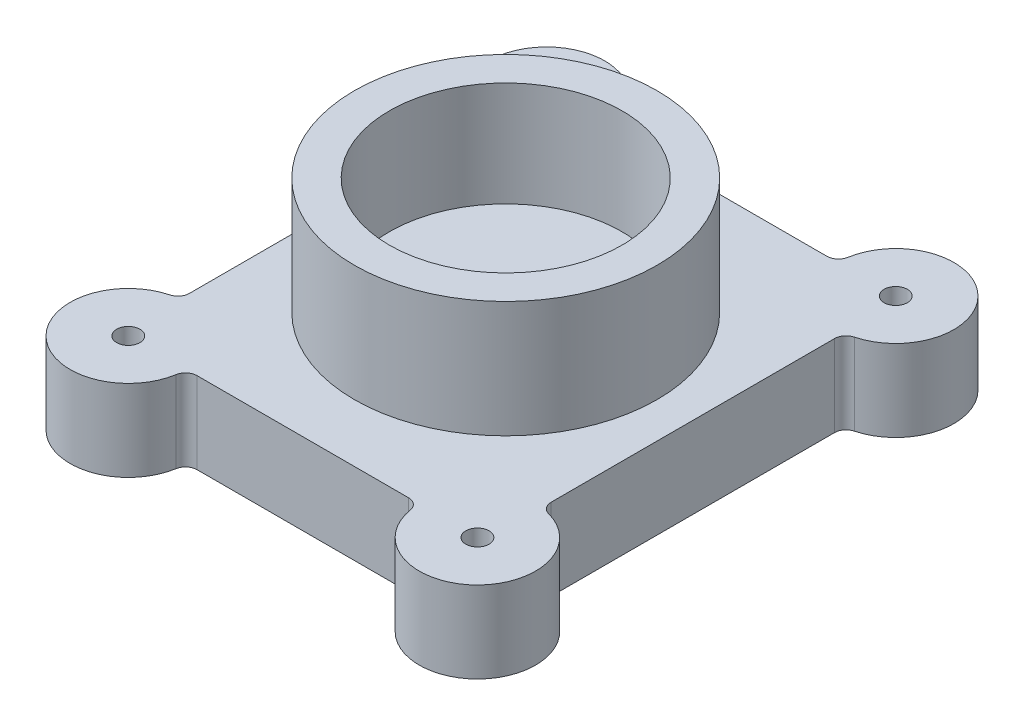
ISO-10303-21;
HEADER;
FILE_DESCRIPTION(('STEP AP214'),'2;1');
FILE_NAME('part.step','',(''),(''),'','','');
FILE_SCHEMA(('AUTOMOTIVE_DESIGN { 1 0 10303 214 1 1 1 1 }'));
ENDSEC;
DATA;
#1=APPLICATION_CONTEXT('core data for automotive mechanical design processes');
#2=APPLICATION_PROTOCOL_DEFINITION('international standard','automotive_design',2000,#1);
#3=PRODUCT_CONTEXT('',#1,'mechanical');
#4=PRODUCT('Part','Part','',(#3));
#5=PRODUCT_RELATED_PRODUCT_CATEGORY('part','',(#4));
#6=PRODUCT_DEFINITION_FORMATION('','',#4);
#7=PRODUCT_DEFINITION_CONTEXT('part definition',#1,'design');
#8=PRODUCT_DEFINITION('design','',#6,#7);
#9=PRODUCT_DEFINITION_SHAPE('','',#8);
#10=(LENGTH_UNIT() NAMED_UNIT(*) SI_UNIT(.MILLI.,.METRE.));
#11=(NAMED_UNIT(*) PLANE_ANGLE_UNIT() SI_UNIT($,.RADIAN.));
#12=(NAMED_UNIT(*) SI_UNIT($,.STERADIAN.) SOLID_ANGLE_UNIT());
#13=UNCERTAINTY_MEASURE_WITH_UNIT(LENGTH_MEASURE(1.E-05),#10,'distance_accuracy_value','');
#14=(GEOMETRIC_REPRESENTATION_CONTEXT(3) GLOBAL_UNCERTAINTY_ASSIGNED_CONTEXT((#13)) GLOBAL_UNIT_ASSIGNED_CONTEXT((#10,
#11,#12)) REPRESENTATION_CONTEXT('',''));
#15=CARTESIAN_POINT('',(0.,0.,0.));
#16=DIRECTION('',(0.,0.,1.));
#17=DIRECTION('',(1.,0.,0.));
#18=AXIS2_PLACEMENT_3D('',#15,#16,#17);
#19=CARTESIAN_POINT('',(-85.4507787273954,70.,189.708800959327));
#20=DIRECTION('',(0.,-1.,0.));
#21=DIRECTION('',(0.,0.,-1.));
#22=AXIS2_PLACEMENT_3D('',#19,#20,#21);
#23=CYLINDRICAL_SURFACE('',#22,10.);
#24=CARTESIAN_POINT('',(-85.4507787273954,0.,189.708800959327));
#25=DIRECTION('',(0.,-1.,0.));
#26=DIRECTION('',(0.,0.,-1.));
#27=AXIS2_PLACEMENT_3D('',#24,#25,#26);
#28=CIRCLE('',#27,10.);
#29=CARTESIAN_POINT('',(-95.310911699228,0.,188.04213429266));
#30=VERTEX_POINT('',#29);
#31=CARTESIAN_POINT('',(-85.4507787273954,0.,179.708800959327));
#32=VERTEX_POINT('',#31);
#33=EDGE_CURVE('E187',#30,#32,#28,.T.);
#34=ORIENTED_EDGE('',*,*,#33,.T.);
#35=DIRECTION('',(0.,-1.,0.));
#36=VECTOR('',#35,1.);
#37=CARTESIAN_POINT('',(-85.4507787273954,70.,179.708800959327));
#38=LINE('',#37,#36);
#39=CARTESIAN_POINT('',(-85.4507787273954,70.,179.708800959327));
#40=VERTEX_POINT('',#39);
#41=EDGE_CURVE('E48',#40,#32,#38,.T.);
#42=ORIENTED_EDGE('',*,*,#41,.F.);
#43=CARTESIAN_POINT('',(-85.4507787273954,70.,189.708800959327));
#44=DIRECTION('',(0.,-1.,0.));
#45=DIRECTION('',(0.,0.,-1.));
#46=AXIS2_PLACEMENT_3D('',#43,#44,#45);
#47=CIRCLE('',#46,10.);
#48=CARTESIAN_POINT('',(-95.310911699228,70.,188.04213429266));
#49=VERTEX_POINT('',#48);
#50=EDGE_CURVE('E231',#49,#40,#47,.T.);
#51=ORIENTED_EDGE('',*,*,#50,.F.);
#52=DIRECTION('',(0.,-1.,0.));
#53=VECTOR('',#52,1.);
#54=CARTESIAN_POINT('',(-95.310911699228,70.,188.04213429266));
#55=LINE('',#54,#53);
#56=EDGE_CURVE('E56',#49,#30,#55,.T.);
#57=ORIENTED_EDGE('',*,*,#56,.T.);
#58=EDGE_LOOP('',(#34,#42,#51,#57));
#59=FACE_BOUND('',#58,.T.);
#60=ADVANCED_FACE('F40',(#59),#23,.F.);
#61=CARTESIAN_POINT('',(-85.4507787273954,70.,179.708800959327));
#62=DIRECTION('',(0.,0.,-1.));
#63=DIRECTION('',(-1.,0.,0.));
#64=AXIS2_PLACEMENT_3D('',#61,#62,#63);
#65=PLANE('',#64);
#66=DIRECTION('',(1.,0.,0.));
#67=VECTOR('',#66,1.);
#68=CARTESIAN_POINT('',(-85.4507787273954,0.,179.708800959327));
#69=LINE('',#68,#67);
#70=CARTESIAN_POINT('',(96.2276256106123,0.,179.708800959327));
#71=VERTEX_POINT('',#70);
#72=EDGE_CURVE('E189',#32,#71,#69,.T.);
#73=ORIENTED_EDGE('',*,*,#72,.T.);
#74=DIRECTION('',(0.,-1.,0.));
#75=VECTOR('',#74,1.);
#76=CARTESIAN_POINT('',(96.2276256106123,70.,179.708800959327));
#77=LINE('',#76,#75);
#78=CARTESIAN_POINT('',(96.2276256106123,70.,179.708800959327));
#79=VERTEX_POINT('',#78);
#80=EDGE_CURVE('E256',#79,#71,#77,.T.);
#81=ORIENTED_EDGE('',*,*,#80,.F.);
#82=DIRECTION('',(1.,0.,0.));
#83=VECTOR('',#82,1.);
#84=CARTESIAN_POINT('',(-85.4507787273954,70.,179.708800959327));
#85=LINE('',#84,#83);
#86=EDGE_CURVE('E120',#40,#79,#85,.T.);
#87=ORIENTED_EDGE('',*,*,#86,.F.);
#88=ORIENTED_EDGE('',*,*,#41,.T.);
#89=EDGE_LOOP('',(#73,#81,#87,#88));
#90=FACE_BOUND('',#89,.T.);
#91=ADVANCED_FACE('F258',(#90),#65,.F.);
#92=CARTESIAN_POINT('',(96.2276256106124,70.,189.708800959327));
#93=DIRECTION('',(0.,-1.,0.));
#94=DIRECTION('',(0.,0.,-1.));
#95=AXIS2_PLACEMENT_3D('',#92,#93,#94);
#96=CYLINDRICAL_SURFACE('',#95,10.);
#97=CARTESIAN_POINT('',(96.2276256106124,0.,189.708800959327));
#98=DIRECTION('',(0.,1.,0.));
#99=DIRECTION('',(0.,0.,1.));
#100=AXIS2_PLACEMENT_3D('',#97,#98,#99);
#101=CIRCLE('',#100,10.);
#102=CARTESIAN_POINT('',(106.087758582445,0.,188.04213429266));
#103=VERTEX_POINT('',#102);
#104=EDGE_CURVE('E193',#103,#71,#101,.T.);
#105=ORIENTED_EDGE('',*,*,#104,.F.);
#106=DIRECTION('',(0.,-1.,0.));
#107=VECTOR('',#106,1.);
#108=CARTESIAN_POINT('',(106.087758582445,70.,188.04213429266));
#109=LINE('',#108,#107);
#110=CARTESIAN_POINT('',(106.087758582445,70.,188.04213429266));
#111=VERTEX_POINT('',#110);
#112=EDGE_CURVE('E254',#111,#103,#109,.T.);
#113=ORIENTED_EDGE('',*,*,#112,.F.);
#114=CARTESIAN_POINT('',(96.2276256106124,70.,189.708800959327));
#115=DIRECTION('',(0.,1.,0.));
#116=DIRECTION('',(0.,0.,1.));
#117=AXIS2_PLACEMENT_3D('',#114,#115,#116);
#118=CIRCLE('',#117,10.);
#119=EDGE_CURVE('E596',#111,#79,#118,.T.);
#120=ORIENTED_EDGE('',*,*,#119,.T.);
#121=ORIENTED_EDGE('',*,*,#80,.T.);
#122=EDGE_LOOP('',(#105,#113,#120,#121));
#123=FACE_BOUND('',#122,.T.);
#124=ADVANCED_FACE('F276',(#123),#96,.F.);
#125=CARTESIAN_POINT('',(155.388423441608,70.,179.708800959327));
#126=DIRECTION('',(0.,-1.,0.));
#127=DIRECTION('',(0.,0.,-1.));
#128=AXIS2_PLACEMENT_3D('',#125,#126,#127);
#129=CYLINDRICAL_SURFACE('',#128,50.);
#130=CARTESIAN_POINT('',(155.388423441608,0.,179.708800959327));
#131=DIRECTION('',(0.,1.,0.));
#132=DIRECTION('',(0.,0.,1.));
#133=AXIS2_PLACEMENT_3D('',#130,#131,#132);
#134=CIRCLE('',#133,50.);
#135=CARTESIAN_POINT('',(168.212109642949,0.,131.381240787003));
#136=VERTEX_POINT('',#135);
#137=EDGE_CURVE('E196',#103,#136,#134,.T.);
#138=ORIENTED_EDGE('',*,*,#137,.T.);
#139=DIRECTION('',(0.,-1.,0.));
#140=VECTOR('',#139,1.);
#141=CARTESIAN_POINT('',(168.212109642949,70.,131.381240787003));
#142=LINE('',#141,#140);
#143=CARTESIAN_POINT('',(168.212109642949,70.,131.381240787003));
#144=VERTEX_POINT('',#143);
#145=EDGE_CURVE('E252',#144,#136,#142,.T.);
#146=ORIENTED_EDGE('',*,*,#145,.F.);
#147=CARTESIAN_POINT('',(155.388423441608,70.,179.708800959327));
#148=DIRECTION('',(0.,1.,0.));
#149=DIRECTION('',(0.,0.,1.));
#150=AXIS2_PLACEMENT_3D('',#147,#148,#149);
#151=CIRCLE('',#150,50.);
#152=EDGE_CURVE('E599',#111,#144,#151,.T.);
#153=ORIENTED_EDGE('',*,*,#152,.F.);
#154=ORIENTED_EDGE('',*,*,#112,.T.);
#155=EDGE_LOOP('',(#138,#146,#153,#154));
#156=FACE_BOUND('',#155,.T.);
#157=ADVANCED_FACE('F280',(#156),#129,.T.);
#158=CARTESIAN_POINT('',(170.776846883217,70.,121.715728752539));
#159=DIRECTION('',(0.,-1.,0.));
#160=DIRECTION('',(0.,0.,-1.));
#161=AXIS2_PLACEMENT_3D('',#158,#159,#160);
#162=CYLINDRICAL_SURFACE('',#161,10.);
#163=CARTESIAN_POINT('',(170.776846883217,0.,121.715728752539));
#164=DIRECTION('',(0.,1.,0.));
#165=DIRECTION('',(0.,0.,1.));
#166=AXIS2_PLACEMENT_3D('',#163,#164,#165);
#167=CIRCLE('',#166,10.);
#168=CARTESIAN_POINT('',(160.776846883217,0.,121.715728752539));
#169=VERTEX_POINT('',#168);
#170=EDGE_CURVE('E199',#169,#136,#167,.T.);
#171=ORIENTED_EDGE('',*,*,#170,.F.);
#172=DIRECTION('',(0.,-1.,0.));
#173=VECTOR('',#172,1.);
#174=CARTESIAN_POINT('',(160.776846883217,70.,121.715728752539));
#175=LINE('',#174,#173);
#176=CARTESIAN_POINT('',(160.776846883217,70.,121.715728752539));
#177=VERTEX_POINT('',#176);
#178=EDGE_CURVE('E250',#177,#169,#175,.T.);
#179=ORIENTED_EDGE('',*,*,#178,.F.);
#180=CARTESIAN_POINT('',(170.776846883217,70.,121.715728752539));
#181=DIRECTION('',(0.,1.,0.));
#182=DIRECTION('',(0.,0.,1.));
#183=AXIS2_PLACEMENT_3D('',#180,#181,#182);
#184=CIRCLE('',#183,10.);
#185=EDGE_CURVE('E601',#177,#144,#184,.T.);
#186=ORIENTED_EDGE('',*,*,#185,.T.);
#187=ORIENTED_EDGE('',*,*,#145,.T.);
#188=EDGE_LOOP('',(#171,#179,#186,#187));
#189=FACE_BOUND('',#188,.T.);
#190=ADVANCED_FACE('F286',(#189),#162,.F.);
#191=CARTESIAN_POINT('',(160.776846883217,70.,121.715728752539));
#192=DIRECTION('',(-1.,0.,0.));
#193=DIRECTION('',(0.,0.,1.));
#194=AXIS2_PLACEMENT_3D('',#191,#192,#193);
#195=PLANE('',#194);
#196=DIRECTION('',(0.,0.,-1.));
#197=VECTOR('',#196,1.);
#198=CARTESIAN_POINT('',(160.776846883217,0.,121.715728752539));
#199=LINE('',#198,#197);
#200=CARTESIAN_POINT('',(160.776846883217,0.,-121.715728752539));
#201=VERTEX_POINT('',#200);
#202=EDGE_CURVE('E202',#169,#201,#199,.T.);
#203=ORIENTED_EDGE('',*,*,#202,.T.);
#204=DIRECTION('',(0.,-1.,0.));
#205=VECTOR('',#204,1.);
#206=CARTESIAN_POINT('',(160.776846883217,70.,-121.715728752539));
#207=LINE('',#206,#205);
#208=CARTESIAN_POINT('',(160.776846883217,70.,-121.715728752539));
#209=VERTEX_POINT('',#208);
#210=EDGE_CURVE('E247',#209,#201,#207,.T.);
#211=ORIENTED_EDGE('',*,*,#210,.F.);
#212=DIRECTION('',(0.,0.,-1.));
#213=VECTOR('',#212,1.);
#214=CARTESIAN_POINT('',(160.776846883217,70.,121.715728752539));
#215=LINE('',#214,#213);
#216=EDGE_CURVE('E604',#177,#209,#215,.T.);
#217=ORIENTED_EDGE('',*,*,#216,.F.);
#218=ORIENTED_EDGE('',*,*,#178,.T.);
#219=EDGE_LOOP('',(#203,#211,#217,#218));
#220=FACE_BOUND('',#219,.T.);
#221=ADVANCED_FACE('F290',(#220),#195,.F.);
#222=CARTESIAN_POINT('',(170.776846883217,70.,-121.715728752539));
#223=DIRECTION('',(0.,-1.,0.));
#224=DIRECTION('',(0.,0.,-1.));
#225=AXIS2_PLACEMENT_3D('',#222,#223,#224);
#226=CYLINDRICAL_SURFACE('',#225,9.99999999999999);
#227=CARTESIAN_POINT('',(170.776846883217,0.,-121.715728752539));
#228=DIRECTION('',(0.,-1.,0.));
#229=DIRECTION('',(0.,0.,-1.));
#230=AXIS2_PLACEMENT_3D('',#227,#228,#229);
#231=CIRCLE('',#230,9.99999999999999);
#232=CARTESIAN_POINT('',(168.212109642949,0.,-131.381240787003));
#233=VERTEX_POINT('',#232);
#234=EDGE_CURVE('E204',#201,#233,#231,.T.);
#235=ORIENTED_EDGE('',*,*,#234,.T.);
#236=DIRECTION('',(0.,-1.,0.));
#237=VECTOR('',#236,1.);
#238=CARTESIAN_POINT('',(168.212109642949,70.,-131.381240787003));
#239=LINE('',#238,#237);
#240=CARTESIAN_POINT('',(168.212109642949,70.,-131.381240787003));
#241=VERTEX_POINT('',#240);
#242=EDGE_CURVE('E245',#241,#233,#239,.T.);
#243=ORIENTED_EDGE('',*,*,#242,.F.);
#244=CARTESIAN_POINT('',(170.776846883217,70.,-121.715728752539));
#245=DIRECTION('',(0.,-1.,0.));
#246=DIRECTION('',(0.,0.,-1.));
#247=AXIS2_PLACEMENT_3D('',#244,#245,#246);
#248=CIRCLE('',#247,9.99999999999999);
#249=EDGE_CURVE('E606',#209,#241,#248,.T.);
#250=ORIENTED_EDGE('',*,*,#249,.F.);
#251=ORIENTED_EDGE('',*,*,#210,.T.);
#252=EDGE_LOOP('',(#235,#243,#250,#251));
#253=FACE_BOUND('',#252,.T.);
#254=ADVANCED_FACE('F294',(#253),#226,.F.);
#255=CARTESIAN_POINT('',(155.388423441608,70.,-179.708800959327));
#256=DIRECTION('',(0.,-1.,0.));
#257=DIRECTION('',(0.,0.,-1.));
#258=AXIS2_PLACEMENT_3D('',#255,#256,#257);
#259=CYLINDRICAL_SURFACE('',#258,50.);
#260=CARTESIAN_POINT('',(155.388423441608,0.,-179.708800959327));
#261=DIRECTION('',(0.,-1.,0.));
#262=DIRECTION('',(0.,0.,-1.));
#263=AXIS2_PLACEMENT_3D('',#260,#261,#262);
#264=CIRCLE('',#263,50.);
#265=CARTESIAN_POINT('',(106.087758582445,0.,-188.04213429266));
#266=VERTEX_POINT('',#265);
#267=EDGE_CURVE('E207',#266,#233,#264,.T.);
#268=ORIENTED_EDGE('',*,*,#267,.F.);
#269=DIRECTION('',(0.,-1.,0.));
#270=VECTOR('',#269,1.);
#271=CARTESIAN_POINT('',(106.087758582445,70.,-188.04213429266));
#272=LINE('',#271,#270);
#273=CARTESIAN_POINT('',(106.087758582445,70.,-188.04213429266));
#274=VERTEX_POINT('',#273);
#275=EDGE_CURVE('E243',#274,#266,#272,.T.);
#276=ORIENTED_EDGE('',*,*,#275,.F.);
#277=CARTESIAN_POINT('',(155.388423441608,70.,-179.708800959327));
#278=DIRECTION('',(0.,-1.,0.));
#279=DIRECTION('',(0.,0.,-1.));
#280=AXIS2_PLACEMENT_3D('',#277,#278,#279);
#281=CIRCLE('',#280,50.);
#282=EDGE_CURVE('E608',#274,#241,#281,.T.);
#283=ORIENTED_EDGE('',*,*,#282,.T.);
#284=ORIENTED_EDGE('',*,*,#242,.T.);
#285=EDGE_LOOP('',(#268,#276,#283,#284));
#286=FACE_BOUND('',#285,.T.);
#287=ADVANCED_FACE('F298',(#286),#259,.T.);
#288=CARTESIAN_POINT('',(96.2276256106123,70.,-189.708800959327));
#289=DIRECTION('',(0.,-1.,0.));
#290=DIRECTION('',(0.,0.,-1.));
#291=AXIS2_PLACEMENT_3D('',#288,#289,#290);
#292=CYLINDRICAL_SURFACE('',#291,10.);
#293=CARTESIAN_POINT('',(96.2276256106123,0.,-189.708800959327));
#294=DIRECTION('',(0.,-1.,0.));
#295=DIRECTION('',(0.,0.,-1.));
#296=AXIS2_PLACEMENT_3D('',#293,#294,#295);
#297=CIRCLE('',#296,10.);
#298=CARTESIAN_POINT('',(96.2276256106123,0.,-179.708800959327));
#299=VERTEX_POINT('',#298);
#300=EDGE_CURVE('E210',#266,#299,#297,.T.);
#301=ORIENTED_EDGE('',*,*,#300,.T.);
#302=DIRECTION('',(0.,-1.,0.));
#303=VECTOR('',#302,1.);
#304=CARTESIAN_POINT('',(96.2276256106123,70.,-179.708800959327));
#305=LINE('',#304,#303);
#306=CARTESIAN_POINT('',(96.2276256106123,70.,-179.708800959327));
#307=VERTEX_POINT('',#306);
#308=EDGE_CURVE('E241',#307,#299,#305,.T.);
#309=ORIENTED_EDGE('',*,*,#308,.F.);
#310=CARTESIAN_POINT('',(96.2276256106123,70.,-189.708800959327));
#311=DIRECTION('',(0.,-1.,0.));
#312=DIRECTION('',(0.,0.,-1.));
#313=AXIS2_PLACEMENT_3D('',#310,#311,#312);
#314=CIRCLE('',#313,10.);
#315=EDGE_CURVE('E611',#274,#307,#314,.T.);
#316=ORIENTED_EDGE('',*,*,#315,.F.);
#317=ORIENTED_EDGE('',*,*,#275,.T.);
#318=EDGE_LOOP('',(#301,#309,#316,#317));
#319=FACE_BOUND('',#318,.T.);
#320=ADVANCED_FACE('F302',(#319),#292,.F.);
#321=CARTESIAN_POINT('',(-85.4507787273954,70.,-179.708800959327));
#322=DIRECTION('',(0.,0.,-1.));
#323=DIRECTION('',(-1.,0.,0.));
#324=AXIS2_PLACEMENT_3D('',#321,#322,#323);
#325=PLANE('',#324);
#326=DIRECTION('',(1.,0.,0.));
#327=VECTOR('',#326,1.);
#328=CARTESIAN_POINT('',(-85.4507787273954,0.,-179.708800959327));
#329=LINE('',#328,#327);
#330=CARTESIAN_POINT('',(-85.4507787273954,0.,-179.708800959327));
#331=VERTEX_POINT('',#330);
#332=EDGE_CURVE('E213',#331,#299,#329,.T.);
#333=ORIENTED_EDGE('',*,*,#332,.F.);
#334=DIRECTION('',(0.,-1.,0.));
#335=VECTOR('',#334,1.);
#336=CARTESIAN_POINT('',(-85.4507787273954,70.,-179.708800959327));
#337=LINE('',#336,#335);
#338=CARTESIAN_POINT('',(-85.4507787273954,70.,-179.708800959327));
#339=VERTEX_POINT('',#338);
#340=EDGE_CURVE('E239',#339,#331,#337,.T.);
#341=ORIENTED_EDGE('',*,*,#340,.F.);
#342=DIRECTION('',(1.,0.,0.));
#343=VECTOR('',#342,1.);
#344=CARTESIAN_POINT('',(-85.4507787273954,70.,-179.708800959327));
#345=LINE('',#344,#343);
#346=EDGE_CURVE('E613',#339,#307,#345,.T.);
#347=ORIENTED_EDGE('',*,*,#346,.T.);
#348=ORIENTED_EDGE('',*,*,#308,.T.);
#349=EDGE_LOOP('',(#333,#341,#347,#348));
#350=FACE_BOUND('',#349,.T.);
#351=ADVANCED_FACE('F306',(#350),#325,.T.);
#352=CARTESIAN_POINT('',(-85.4507787273954,70.,-189.708800959327));
#353=DIRECTION('',(0.,-1.,0.));
#354=DIRECTION('',(0.,0.,-1.));
#355=AXIS2_PLACEMENT_3D('',#352,#353,#354);
#356=CYLINDRICAL_SURFACE('',#355,10.);
#357=CARTESIAN_POINT('',(-85.4507787273954,0.,-189.708800959327));
#358=DIRECTION('',(0.,1.,0.));
#359=DIRECTION('',(0.,0.,1.));
#360=AXIS2_PLACEMENT_3D('',#357,#358,#359);
#361=CIRCLE('',#360,10.);
#362=CARTESIAN_POINT('',(-95.3109116992281,0.,-188.04213429266));
#363=VERTEX_POINT('',#362);
#364=EDGE_CURVE('E216',#363,#331,#361,.T.);
#365=ORIENTED_EDGE('',*,*,#364,.F.);
#366=DIRECTION('',(0.,-1.,0.));
#367=VECTOR('',#366,1.);
#368=CARTESIAN_POINT('',(-95.3109116992281,70.,-188.04213429266));
#369=LINE('',#368,#367);
#370=CARTESIAN_POINT('',(-95.3109116992281,70.,-188.04213429266));
#371=VERTEX_POINT('',#370);
#372=EDGE_CURVE('E237',#371,#363,#369,.T.);
#373=ORIENTED_EDGE('',*,*,#372,.F.);
#374=CARTESIAN_POINT('',(-85.4507787273954,70.,-189.708800959327));
#375=DIRECTION('',(0.,1.,0.));
#376=DIRECTION('',(0.,0.,1.));
#377=AXIS2_PLACEMENT_3D('',#374,#375,#376);
#378=CIRCLE('',#377,10.);
#379=EDGE_CURVE('E616',#371,#339,#378,.T.);
#380=ORIENTED_EDGE('',*,*,#379,.T.);
#381=ORIENTED_EDGE('',*,*,#340,.T.);
#382=EDGE_LOOP('',(#365,#373,#380,#381));
#383=FACE_BOUND('',#382,.T.);
#384=ADVANCED_FACE('F310',(#383),#356,.F.);
#385=CARTESIAN_POINT('',(-144.611576558392,70.,-179.708800959327));
#386=DIRECTION('',(0.,-1.,0.));
#387=DIRECTION('',(0.,0.,-1.));
#388=AXIS2_PLACEMENT_3D('',#385,#386,#387);
#389=CYLINDRICAL_SURFACE('',#388,50.);
#390=CARTESIAN_POINT('',(-144.611576558392,0.,-179.708800959327));
#391=DIRECTION('',(0.,1.,0.));
#392=DIRECTION('',(0.,0.,1.));
#393=AXIS2_PLACEMENT_3D('',#390,#391,#392);
#394=CIRCLE('',#393,50.);
#395=CARTESIAN_POINT('',(-157.435262759732,0.,-131.381240787003));
#396=VERTEX_POINT('',#395);
#397=EDGE_CURVE('E219',#363,#396,#394,.T.);
#398=ORIENTED_EDGE('',*,*,#397,.T.);
#399=DIRECTION('',(0.,-1.,0.));
#400=VECTOR('',#399,1.);
#401=CARTESIAN_POINT('',(-157.435262759732,70.,-131.381240787003));
#402=LINE('',#401,#400);
#403=CARTESIAN_POINT('',(-157.435262759732,70.,-131.381240787003));
#404=VERTEX_POINT('',#403);
#405=EDGE_CURVE('E235',#404,#396,#402,.T.);
#406=ORIENTED_EDGE('',*,*,#405,.F.);
#407=CARTESIAN_POINT('',(-144.611576558392,70.,-179.708800959327));
#408=DIRECTION('',(0.,1.,0.));
#409=DIRECTION('',(0.,0.,1.));
#410=AXIS2_PLACEMENT_3D('',#407,#408,#409);
#411=CIRCLE('',#410,50.);
#412=EDGE_CURVE('E182',#371,#404,#411,.T.);
#413=ORIENTED_EDGE('',*,*,#412,.F.);
#414=ORIENTED_EDGE('',*,*,#372,.T.);
#415=EDGE_LOOP('',(#398,#406,#413,#414));
#416=FACE_BOUND('',#415,.T.);
#417=ADVANCED_FACE('F314',(#416),#389,.T.);
#418=CARTESIAN_POINT('',(-160.,70.,-121.715728752539));
#419=DIRECTION('',(0.,-1.,0.));
#420=DIRECTION('',(0.,0.,-1.));
#421=AXIS2_PLACEMENT_3D('',#418,#419,#420);
#422=CYLINDRICAL_SURFACE('',#421,10.);
#423=CARTESIAN_POINT('',(-160.,0.,-121.715728752539));
#424=DIRECTION('',(0.,1.,0.));
#425=DIRECTION('',(0.,0.,1.));
#426=AXIS2_PLACEMENT_3D('',#423,#424,#425);
#427=CIRCLE('',#426,10.);
#428=CARTESIAN_POINT('',(-150.,0.,-121.715728752539));
#429=VERTEX_POINT('',#428);
#430=EDGE_CURVE('E222',#429,#396,#427,.T.);
#431=ORIENTED_EDGE('',*,*,#430,.F.);
#432=DIRECTION('',(0.,-1.,0.));
#433=VECTOR('',#432,1.);
#434=CARTESIAN_POINT('',(-150.,70.,-121.715728752539));
#435=LINE('',#434,#433);
#436=CARTESIAN_POINT('',(-150.,70.,-121.715728752539));
#437=VERTEX_POINT('',#436);
#438=EDGE_CURVE('E169',#437,#429,#435,.T.);
#439=ORIENTED_EDGE('',*,*,#438,.F.);
#440=CARTESIAN_POINT('',(-160.,70.,-121.715728752539));
#441=DIRECTION('',(0.,1.,0.));
#442=DIRECTION('',(0.,0.,1.));
#443=AXIS2_PLACEMENT_3D('',#440,#441,#442);
#444=CIRCLE('',#443,10.);
#445=EDGE_CURVE('E180',#437,#404,#444,.T.);
#446=ORIENTED_EDGE('',*,*,#445,.T.);
#447=ORIENTED_EDGE('',*,*,#405,.T.);
#448=EDGE_LOOP('',(#431,#439,#446,#447));
#449=FACE_BOUND('',#448,.T.);
#450=ADVANCED_FACE('F318',(#449),#422,.F.);
#451=CARTESIAN_POINT('',(-150.,70.,121.715728752539));
#452=DIRECTION('',(-1.,0.,0.));
#453=DIRECTION('',(0.,0.,1.));
#454=AXIS2_PLACEMENT_3D('',#451,#452,#453);
#455=PLANE('',#454);
#456=DIRECTION('',(0.,0.,-1.));
#457=VECTOR('',#456,1.);
#458=CARTESIAN_POINT('',(-150.,0.,121.715728752539));
#459=LINE('',#458,#457);
#460=CARTESIAN_POINT('',(-150.,0.,121.715728752539));
#461=VERTEX_POINT('',#460);
#462=EDGE_CURVE('E166',#461,#429,#459,.T.);
#463=ORIENTED_EDGE('',*,*,#462,.F.);
#464=DIRECTION('',(0.,-1.,0.));
#465=VECTOR('',#464,1.);
#466=CARTESIAN_POINT('',(-150.,70.,121.715728752539));
#467=LINE('',#466,#465);
#468=CARTESIAN_POINT('',(-150.,70.,121.715728752539));
#469=VERTEX_POINT('',#468);
#470=EDGE_CURVE('E160',#469,#461,#467,.T.);
#471=ORIENTED_EDGE('',*,*,#470,.F.);
#472=DIRECTION('',(0.,0.,-1.));
#473=VECTOR('',#472,1.);
#474=CARTESIAN_POINT('',(-150.,70.,121.715728752539));
#475=LINE('',#474,#473);
#476=EDGE_CURVE('E164',#469,#437,#475,.T.);
#477=ORIENTED_EDGE('',*,*,#476,.T.);
#478=ORIENTED_EDGE('',*,*,#438,.T.);
#479=EDGE_LOOP('',(#463,#471,#477,#478));
#480=FACE_BOUND('',#479,.T.);
#481=ADVANCED_FACE('F162',(#480),#455,.T.);
#482=CARTESIAN_POINT('',(-160.,70.,121.715728752539));
#483=DIRECTION('',(0.,-1.,0.));
#484=DIRECTION('',(0.,0.,-1.));
#485=AXIS2_PLACEMENT_3D('',#482,#483,#484);
#486=CYLINDRICAL_SURFACE('',#485,10.);
#487=CARTESIAN_POINT('',(-160.,0.,121.715728752539));
#488=DIRECTION('',(0.,-1.,0.));
#489=DIRECTION('',(0.,0.,-1.));
#490=AXIS2_PLACEMENT_3D('',#487,#488,#489);
#491=CIRCLE('',#490,10.);
#492=CARTESIAN_POINT('',(-157.435262759732,0.,131.381240787003));
#493=VERTEX_POINT('',#492);
#494=EDGE_CURVE('E226',#461,#493,#491,.T.);
#495=ORIENTED_EDGE('',*,*,#494,.T.);
#496=DIRECTION('',(0.,-1.,0.));
#497=VECTOR('',#496,1.);
#498=CARTESIAN_POINT('',(-157.435262759732,70.,131.381240787003));
#499=LINE('',#498,#497);
#500=CARTESIAN_POINT('',(-157.435262759732,70.,131.381240787003));
#501=VERTEX_POINT('',#500);
#502=EDGE_CURVE('E107',#501,#493,#499,.T.);
#503=ORIENTED_EDGE('',*,*,#502,.F.);
#504=CARTESIAN_POINT('',(-160.,70.,121.715728752539));
#505=DIRECTION('',(0.,-1.,0.));
#506=DIRECTION('',(0.,0.,-1.));
#507=AXIS2_PLACEMENT_3D('',#504,#505,#506);
#508=CIRCLE('',#507,10.);
#509=EDGE_CURVE('E171',#469,#501,#508,.T.);
#510=ORIENTED_EDGE('',*,*,#509,.F.);
#511=ORIENTED_EDGE('',*,*,#470,.T.);
#512=EDGE_LOOP('',(#495,#503,#510,#511));
#513=FACE_BOUND('',#512,.T.);
#514=ADVANCED_FACE('F172',(#513),#486,.F.);
#515=CARTESIAN_POINT('',(-144.611576558392,70.,179.708800959327));
#516=DIRECTION('',(0.,-1.,0.));
#517=DIRECTION('',(0.,0.,-1.));
#518=AXIS2_PLACEMENT_3D('',#515,#516,#517);
#519=CYLINDRICAL_SURFACE('',#518,50.);
#520=CARTESIAN_POINT('',(-144.611576558392,0.,179.708800959327));
#521=DIRECTION('',(0.,-1.,0.));
#522=DIRECTION('',(0.,0.,-1.));
#523=AXIS2_PLACEMENT_3D('',#520,#521,#522);
#524=CIRCLE('',#523,50.);
#525=EDGE_CURVE('E228',#30,#493,#524,.T.);
#526=ORIENTED_EDGE('',*,*,#525,.F.);
#527=ORIENTED_EDGE('',*,*,#56,.F.);
#528=CARTESIAN_POINT('',(-144.611576558392,70.,179.708800959327));
#529=DIRECTION('',(0.,-1.,0.));
#530=DIRECTION('',(0.,0.,-1.));
#531=AXIS2_PLACEMENT_3D('',#528,#529,#530);
#532=CIRCLE('',#531,50.);
#533=EDGE_CURVE('E175',#49,#501,#532,.T.);
#534=ORIENTED_EDGE('',*,*,#533,.T.);
#535=ORIENTED_EDGE('',*,*,#502,.T.);
#536=EDGE_LOOP('',(#526,#527,#534,#535));
#537=FACE_BOUND('',#536,.T.);
#538=ADVANCED_FACE('F261',(#537),#519,.T.);
#539=CARTESIAN_POINT('',(-85.4507787273954,70.,189.708800959327));
#540=DIRECTION('',(0.,-1.,0.));
#541=DIRECTION('',(0.,0.,-1.));
#542=AXIS2_PLACEMENT_3D('',#539,#540,#541);
#543=PLANE('',#542);
#544=CARTESIAN_POINT('',(155.388423441608,70.,179.708800959327));
#545=DIRECTION('',(0.,1.,0.));
#546=DIRECTION('',(0.,0.,1.));
#547=AXIS2_PLACEMENT_3D('',#544,#545,#546);
#548=CIRCLE('',#547,10.);
#549=CARTESIAN_POINT('',(155.388423441608,70.,189.708800959327));
#550=VERTEX_POINT('',#549);
#551=EDGE_CURVE('E575',#550,#550,#548,.T.);
#552=ORIENTED_EDGE('',*,*,#551,.F.);
#553=EDGE_LOOP('',(#552));
#554=FACE_BOUND('',#553,.T.);
#555=CARTESIAN_POINT('',(-144.611576558392,70.,-179.708800959327));
#556=DIRECTION('',(0.,1.,0.));
#557=DIRECTION('',(0.,0.,1.));
#558=AXIS2_PLACEMENT_3D('',#555,#556,#557);
#559=CIRCLE('',#558,10.);
#560=CARTESIAN_POINT('',(-144.611576558392,70.,-169.708800959327));
#561=VERTEX_POINT('',#560);
#562=EDGE_CURVE('E582',#561,#561,#559,.T.);
#563=ORIENTED_EDGE('',*,*,#562,.F.);
#564=EDGE_LOOP('',(#563));
#565=FACE_BOUND('',#564,.T.);
#566=CARTESIAN_POINT('',(155.388423441608,70.,-179.708800959327));
#567=DIRECTION('',(0.,1.,0.));
#568=DIRECTION('',(0.,0.,1.));
#569=AXIS2_PLACEMENT_3D('',#566,#567,#568);
#570=CIRCLE('',#569,10.);
#571=CARTESIAN_POINT('',(155.388423441608,70.,-169.708800959327));
#572=VERTEX_POINT('',#571);
#573=EDGE_CURVE('E567',#572,#572,#570,.T.);
#574=ORIENTED_EDGE('',*,*,#573,.F.);
#575=EDGE_LOOP('',(#574));
#576=FACE_BOUND('',#575,.T.);
#577=CARTESIAN_POINT('',(-144.611576558392,70.,179.708800959327));
#578=DIRECTION('',(0.,1.,0.));
#579=DIRECTION('',(0.,0.,1.));
#580=AXIS2_PLACEMENT_3D('',#577,#578,#579);
#581=CIRCLE('',#580,10.);
#582=CARTESIAN_POINT('',(-144.611576558392,70.,189.708800959327));
#583=VERTEX_POINT('',#582);
#584=EDGE_CURVE('E578',#583,#583,#581,.T.);
#585=ORIENTED_EDGE('',*,*,#584,.F.);
#586=EDGE_LOOP('',(#585));
#587=FACE_BOUND('',#586,.T.);
#588=CARTESIAN_POINT('',(0.,70.,0.));
#589=DIRECTION('',(0.,-1.,0.));
#590=DIRECTION('',(0.,0.,-1.));
#591=AXIS2_PLACEMENT_3D('',#588,#589,#590);
#592=CIRCLE('',#591,130.);
#593=CARTESIAN_POINT('',(0.,70.,-130.));
#594=VERTEX_POINT('',#593);
#595=EDGE_CURVE('E11',#594,#594,#592,.F.);
#596=ORIENTED_EDGE('',*,*,#595,.F.);
#597=EDGE_LOOP('',(#596));
#598=FACE_BOUND('',#597,.T.);
#599=ORIENTED_EDGE('',*,*,#50,.T.);
#600=ORIENTED_EDGE('',*,*,#86,.T.);
#601=ORIENTED_EDGE('',*,*,#119,.F.);
#602=ORIENTED_EDGE('',*,*,#152,.T.);
#603=ORIENTED_EDGE('',*,*,#185,.F.);
#604=ORIENTED_EDGE('',*,*,#216,.T.);
#605=ORIENTED_EDGE('',*,*,#249,.T.);
#606=ORIENTED_EDGE('',*,*,#282,.F.);
#607=ORIENTED_EDGE('',*,*,#315,.T.);
#608=ORIENTED_EDGE('',*,*,#346,.F.);
#609=ORIENTED_EDGE('',*,*,#379,.F.);
#610=ORIENTED_EDGE('',*,*,#412,.T.);
#611=ORIENTED_EDGE('',*,*,#445,.F.);
#612=ORIENTED_EDGE('',*,*,#476,.F.);
#613=ORIENTED_EDGE('',*,*,#509,.T.);
#614=ORIENTED_EDGE('',*,*,#533,.F.);
#615=EDGE_LOOP('',(#599,#600,#601,#602,#603,#604,#605,#606,#607,#608,#609,#610,#611,#612,#613,#614));
#616=FACE_BOUND('',#615,.T.);
#617=ADVANCED_FACE('F178',(#554,#565,#576,#587,#598,#616),#543,.F.);
#618=CARTESIAN_POINT('',(-85.4507787273954,0.,189.708800959327));
#619=DIRECTION('',(0.,-1.,0.));
#620=DIRECTION('',(0.,0.,-1.));
#621=AXIS2_PLACEMENT_3D('',#618,#619,#620);
#622=PLANE('',#621);
#623=CARTESIAN_POINT('',(155.388423441608,0.,179.708800959327));
#624=DIRECTION('',(0.,1.,0.));
#625=DIRECTION('',(0.,0.,1.));
#626=AXIS2_PLACEMENT_3D('',#623,#624,#625);
#627=CIRCLE('',#626,10.);
#628=CARTESIAN_POINT('',(155.388423441608,0.,189.708800959327));
#629=VERTEX_POINT('',#628);
#630=EDGE_CURVE('E579',#629,#629,#627,.T.);
#631=ORIENTED_EDGE('',*,*,#630,.T.);
#632=EDGE_LOOP('',(#631));
#633=FACE_BOUND('',#632,.T.);
#634=CARTESIAN_POINT('',(-144.611576558392,0.,-179.708800959327));
#635=DIRECTION('',(0.,1.,0.));
#636=DIRECTION('',(0.,0.,1.));
#637=AXIS2_PLACEMENT_3D('',#634,#635,#636);
#638=CIRCLE('',#637,10.);
#639=CARTESIAN_POINT('',(-144.611576558392,0.,-169.708800959327));
#640=VERTEX_POINT('',#639);
#641=EDGE_CURVE('E573',#640,#640,#638,.T.);
#642=ORIENTED_EDGE('',*,*,#641,.T.);
#643=EDGE_LOOP('',(#642));
#644=FACE_BOUND('',#643,.T.);
#645=CARTESIAN_POINT('',(155.388423441608,0.,-179.708800959327));
#646=DIRECTION('',(0.,1.,0.));
#647=DIRECTION('',(0.,0.,1.));
#648=AXIS2_PLACEMENT_3D('',#645,#646,#647);
#649=CIRCLE('',#648,10.);
#650=CARTESIAN_POINT('',(155.388423441608,0.,-169.708800959327));
#651=VERTEX_POINT('',#650);
#652=EDGE_CURVE('E563',#651,#651,#649,.T.);
#653=ORIENTED_EDGE('',*,*,#652,.T.);
#654=EDGE_LOOP('',(#653));
#655=FACE_BOUND('',#654,.T.);
#656=CARTESIAN_POINT('',(-144.611576558392,0.,179.708800959327));
#657=DIRECTION('',(0.,1.,0.));
#658=DIRECTION('',(0.,0.,1.));
#659=AXIS2_PLACEMENT_3D('',#656,#657,#658);
#660=CIRCLE('',#659,10.);
#661=CARTESIAN_POINT('',(-144.611576558392,0.,189.708800959327));
#662=VERTEX_POINT('',#661);
#663=EDGE_CURVE('E587',#662,#662,#660,.T.);
#664=ORIENTED_EDGE('',*,*,#663,.T.);
#665=EDGE_LOOP('',(#664));
#666=FACE_BOUND('',#665,.T.);
#667=ORIENTED_EDGE('',*,*,#33,.F.);
#668=ORIENTED_EDGE('',*,*,#525,.T.);
#669=ORIENTED_EDGE('',*,*,#494,.F.);
#670=ORIENTED_EDGE('',*,*,#462,.T.);
#671=ORIENTED_EDGE('',*,*,#430,.T.);
#672=ORIENTED_EDGE('',*,*,#397,.F.);
#673=ORIENTED_EDGE('',*,*,#364,.T.);
#674=ORIENTED_EDGE('',*,*,#332,.T.);
#675=ORIENTED_EDGE('',*,*,#300,.F.);
#676=ORIENTED_EDGE('',*,*,#267,.T.);
#677=ORIENTED_EDGE('',*,*,#234,.F.);
#678=ORIENTED_EDGE('',*,*,#202,.F.);
#679=ORIENTED_EDGE('',*,*,#170,.T.);
#680=ORIENTED_EDGE('',*,*,#137,.F.);
#681=ORIENTED_EDGE('',*,*,#104,.T.);
#682=ORIENTED_EDGE('',*,*,#72,.F.);
#683=EDGE_LOOP('',(#667,#668,#669,#670,#671,#672,#673,#674,#675,#676,#677,#678,#679,#680,#681,#682));
#684=FACE_BOUND('',#683,.T.);
#685=ADVANCED_FACE('F260',(#633,#644,#655,#666,#684),#622,.T.);
#686=CARTESIAN_POINT('',(0.,170.,0.));
#687=DIRECTION('',(0.,-1.,0.));
#688=DIRECTION('',(0.,0.,-1.));
#689=AXIS2_PLACEMENT_3D('',#686,#687,#688);
#690=CYLINDRICAL_SURFACE('',#689,130.);
#691=CARTESIAN_POINT('',(0.,170.,0.));
#692=DIRECTION('',(0.,1.,0.));
#693=DIRECTION('',(0.,0.,1.));
#694=AXIS2_PLACEMENT_3D('',#691,#692,#693);
#695=CIRCLE('',#694,130.);
#696=CARTESIAN_POINT('',(0.,170.,130.));
#697=VERTEX_POINT('',#696);
#698=EDGE_CURVE('E190',#697,#697,#695,.T.);
#699=ORIENTED_EDGE('',*,*,#698,.F.);
#700=EDGE_LOOP('',(#699));
#701=FACE_BOUND('',#700,.T.);
#702=ORIENTED_EDGE('',*,*,#595,.T.);
#703=EDGE_LOOP('',(#702));
#704=FACE_BOUND('',#703,.T.);
#705=ADVANCED_FACE('F344',(#701,#704),#690,.T.);
#706=CARTESIAN_POINT('',(0.,170.,0.));
#707=DIRECTION('',(0.,1.,0.));
#708=DIRECTION('',(0.,0.,1.));
#709=AXIS2_PLACEMENT_3D('',#706,#707,#708);
#710=PLANE('',#709);
#711=CARTESIAN_POINT('',(0.,170.,0.));
#712=DIRECTION('',(0.,1.,0.));
#713=DIRECTION('',(0.,0.,1.));
#714=AXIS2_PLACEMENT_3D('',#711,#712,#713);
#715=CIRCLE('',#714,100.);
#716=CARTESIAN_POINT('',(0.,170.,100.));
#717=VERTEX_POINT('',#716);
#718=EDGE_CURVE('E564',#717,#717,#715,.T.);
#719=ORIENTED_EDGE('',*,*,#718,.F.);
#720=EDGE_LOOP('',(#719));
#721=FACE_BOUND('',#720,.T.);
#722=ORIENTED_EDGE('',*,*,#698,.T.);
#723=EDGE_LOOP('',(#722));
#724=FACE_BOUND('',#723,.T.);
#725=ADVANCED_FACE('F349',(#721,#724),#710,.T.);
#726=CARTESIAN_POINT('',(-144.611576558392,0.,179.708800959327));
#727=DIRECTION('',(0.,1.,0.));
#728=DIRECTION('',(0.,0.,1.));
#729=AXIS2_PLACEMENT_3D('',#726,#727,#728);
#730=CYLINDRICAL_SURFACE('',#729,10.);
#731=ORIENTED_EDGE('',*,*,#663,.F.);
#732=EDGE_LOOP('',(#731));
#733=FACE_BOUND('',#732,.T.);
#734=ORIENTED_EDGE('',*,*,#584,.T.);
#735=EDGE_LOOP('',(#734));
#736=FACE_BOUND('',#735,.T.);
#737=ADVANCED_FACE('F373',(#733,#736),#730,.F.);
#738=CARTESIAN_POINT('',(155.388423441608,0.,-179.708800959327));
#739=DIRECTION('',(0.,1.,0.));
#740=DIRECTION('',(0.,0.,1.));
#741=AXIS2_PLACEMENT_3D('',#738,#739,#740);
#742=CYLINDRICAL_SURFACE('',#741,10.);
#743=ORIENTED_EDGE('',*,*,#652,.F.);
#744=EDGE_LOOP('',(#743));
#745=FACE_BOUND('',#744,.T.);
#746=ORIENTED_EDGE('',*,*,#573,.T.);
#747=EDGE_LOOP('',(#746));
#748=FACE_BOUND('',#747,.T.);
#749=ADVANCED_FACE('F378',(#745,#748),#742,.F.);
#750=CARTESIAN_POINT('',(-144.611576558392,0.,-179.708800959327));
#751=DIRECTION('',(0.,1.,0.));
#752=DIRECTION('',(0.,0.,1.));
#753=AXIS2_PLACEMENT_3D('',#750,#751,#752);
#754=CYLINDRICAL_SURFACE('',#753,10.);
#755=ORIENTED_EDGE('',*,*,#641,.F.);
#756=EDGE_LOOP('',(#755));
#757=FACE_BOUND('',#756,.T.);
#758=ORIENTED_EDGE('',*,*,#562,.T.);
#759=EDGE_LOOP('',(#758));
#760=FACE_BOUND('',#759,.T.);
#761=ADVANCED_FACE('F389',(#757,#760),#754,.F.);
#762=CARTESIAN_POINT('',(155.388423441608,0.,179.708800959327));
#763=DIRECTION('',(0.,1.,0.));
#764=DIRECTION('',(0.,0.,1.));
#765=AXIS2_PLACEMENT_3D('',#762,#763,#764);
#766=CYLINDRICAL_SURFACE('',#765,10.);
#767=ORIENTED_EDGE('',*,*,#630,.F.);
#768=EDGE_LOOP('',(#767));
#769=FACE_BOUND('',#768,.T.);
#770=ORIENTED_EDGE('',*,*,#551,.T.);
#771=EDGE_LOOP('',(#770));
#772=FACE_BOUND('',#771,.T.);
#773=ADVANCED_FACE('F400',(#769,#772),#766,.F.);
#774=CARTESIAN_POINT('',(0.,80.,0.));
#775=DIRECTION('',(0.,1.,0.));
#776=DIRECTION('',(0.,0.,1.));
#777=AXIS2_PLACEMENT_3D('',#774,#775,#776);
#778=CYLINDRICAL_SURFACE('',#777,100.);
#779=CARTESIAN_POINT('',(0.,80.,0.));
#780=DIRECTION('',(0.,1.,0.));
#781=DIRECTION('',(0.,0.,1.));
#782=AXIS2_PLACEMENT_3D('',#779,#780,#781);
#783=CIRCLE('',#782,100.);
#784=CARTESIAN_POINT('',(0.,80.,100.));
#785=VERTEX_POINT('',#784);
#786=EDGE_CURVE('E562',#785,#785,#783,.T.);
#787=CARTESIAN_POINT('',(0.,80.,100.));
#788=CARTESIAN_POINT('',(0.,80.9375,100.));
#789=CARTESIAN_POINT('',(0.,81.875,100.));
#790=CARTESIAN_POINT('',(0.,83.75,100.));
#791=CARTESIAN_POINT('',(0.,84.6875,100.));
#792=CARTESIAN_POINT('',(0.,86.5625,100.));
#793=CARTESIAN_POINT('',(0.,87.5,100.));
#794=CARTESIAN_POINT('',(0.,89.375,100.));
#795=CARTESIAN_POINT('',(0.,90.3125,100.));
#796=CARTESIAN_POINT('',(0.,92.1875,100.));
#797=CARTESIAN_POINT('',(0.,93.125,100.));
#798=CARTESIAN_POINT('',(0.,95.,100.));
#799=CARTESIAN_POINT('',(0.,95.9375,100.));
#800=CARTESIAN_POINT('',(0.,97.8125,100.));
#801=CARTESIAN_POINT('',(0.,98.75,100.));
#802=CARTESIAN_POINT('',(0.,100.625,100.));
#803=CARTESIAN_POINT('',(0.,101.5625,100.));
#804=CARTESIAN_POINT('',(0.,103.4375,100.));
#805=CARTESIAN_POINT('',(0.,104.375,100.));
#806=CARTESIAN_POINT('',(0.,106.25,100.));
#807=CARTESIAN_POINT('',(0.,107.1875,100.));
#808=CARTESIAN_POINT('',(0.,109.0625,100.));
#809=CARTESIAN_POINT('',(0.,110.,100.));
#810=CARTESIAN_POINT('',(0.,111.875,100.));
#811=CARTESIAN_POINT('',(0.,112.8125,100.));
#812=CARTESIAN_POINT('',(0.,114.6875,100.));
#813=CARTESIAN_POINT('',(0.,115.625,100.));
#814=CARTESIAN_POINT('',(0.,117.5,100.));
#815=CARTESIAN_POINT('',(0.,118.4375,100.));
#816=CARTESIAN_POINT('',(0.,120.3125,100.));
#817=CARTESIAN_POINT('',(0.,121.25,100.));
#818=CARTESIAN_POINT('',(0.,123.125,100.));
#819=CARTESIAN_POINT('',(0.,124.0625,100.));
#820=CARTESIAN_POINT('',(0.,125.9375,100.));
#821=CARTESIAN_POINT('',(0.,126.875,100.));
#822=CARTESIAN_POINT('',(0.,128.75,100.));
#823=CARTESIAN_POINT('',(0.,129.6875,100.));
#824=CARTESIAN_POINT('',(0.,131.5625,100.));
#825=CARTESIAN_POINT('',(0.,132.5,100.));
#826=CARTESIAN_POINT('',(0.,134.375,100.));
#827=CARTESIAN_POINT('',(0.,135.3125,100.));
#828=CARTESIAN_POINT('',(0.,137.1875,100.));
#829=CARTESIAN_POINT('',(0.,138.125,100.));
#830=CARTESIAN_POINT('',(0.,140.,100.));
#831=CARTESIAN_POINT('',(0.,140.9375,100.));
#832=CARTESIAN_POINT('',(0.,142.8125,100.));
#833=CARTESIAN_POINT('',(0.,143.75,100.));
#834=CARTESIAN_POINT('',(0.,145.625,100.));
#835=CARTESIAN_POINT('',(0.,146.5625,100.));
#836=CARTESIAN_POINT('',(0.,148.4375,100.));
#837=CARTESIAN_POINT('',(0.,149.375,100.));
#838=CARTESIAN_POINT('',(0.,151.25,100.));
#839=CARTESIAN_POINT('',(0.,152.1875,100.));
#840=CARTESIAN_POINT('',(0.,154.0625,100.));
#841=CARTESIAN_POINT('',(0.,155.,100.));
#842=CARTESIAN_POINT('',(0.,156.875,100.));
#843=CARTESIAN_POINT('',(0.,157.8125,100.));
#844=CARTESIAN_POINT('',(0.,159.6875,100.));
#845=CARTESIAN_POINT('',(0.,160.625,100.));
#846=CARTESIAN_POINT('',(0.,162.5,100.));
#847=CARTESIAN_POINT('',(0.,163.4375,100.));
#848=CARTESIAN_POINT('',(0.,165.3125,100.));
#849=CARTESIAN_POINT('',(0.,166.25,100.));
#850=CARTESIAN_POINT('',(0.,168.125,100.));
#851=CARTESIAN_POINT('',(0.,169.0625,100.));
#852=CARTESIAN_POINT('',(0.,170.,100.));
#853=B_SPLINE_CURVE_WITH_KNOTS('',3,(#787,#788,#789,#790,#791,#792,#793,#794,#795,#796,#797,
#798,#799,#800,#801,#802,#803,#804,#805,#806,#807,#808,#809,#810,#811,#812,#813,#814,#815,#816,
#817,#818,#819,#820,#821,#822,#823,#824,#825,#826,#827,#828,#829,#830,#831,#832,#833,#834,#835,
#836,#837,#838,#839,#840,#841,#842,#843,#844,#845,#846,#847,#848,#849,#850,#851,#852),
.UNSPECIFIED.,.F.,.F.,(4,2,2,2,2,2,2,2,2,2,2,2,2,2,2,2,2,2,2,2,2,2,2,2,2,2,2,2,2,2,2,2,4),(0.,
2.81250000000001,5.62500000000001,8.4375,11.25,14.0625,16.875,19.6875,22.5,25.3125,28.125,
30.9375,33.75,36.5625,39.375,42.1875,45.,47.8125,50.625,53.4375,56.25,59.0625,61.875,64.6875,
67.5,70.3125,73.125,75.9375,78.75,81.5625,84.375,87.1875,90.),.UNSPECIFIED.);
#854=EDGE_CURVE('BSEAM411',#785,#717,#853,.T.);
#855=ORIENTED_EDGE('',*,*,#786,.F.);
#856=ORIENTED_EDGE('',*,*,#718,.T.);
#857=ORIENTED_EDGE('',*,*,#854,.T.);
#858=ORIENTED_EDGE('',*,*,#854,.F.);
#859=EDGE_LOOP('',(#855,#857,#856,#858));
#860=FACE_BOUND('',#859,.T.);
#861=ADVANCED_FACE('F411',(#860),#778,.F.);
#862=CARTESIAN_POINT('',(0.,80.,0.));
#863=DIRECTION('',(0.,1.,0.));
#864=DIRECTION('',(0.,0.,1.));
#865=AXIS2_PLACEMENT_3D('',#862,#863,#864);
#866=PLANE('',#865);
#867=ORIENTED_EDGE('',*,*,#786,.T.);
#868=EDGE_LOOP('',(#867));
#869=FACE_BOUND('',#868,.T.);
#870=ADVANCED_FACE('F430',(#869),#866,.T.);
#871=CLOSED_SHELL('',(#60,#91,#124,#157,#190,#221,#254,#287,#320,#351,#384,#417,#450,#481,#514,
#538,#617,#685,#705,#725,#737,#749,#761,#773,#861,#870));
#872=MANIFOLD_SOLID_BREP('B2',#871);
#873=ADVANCED_BREP_SHAPE_REPRESENTATION('',(#18,#872),#14);
#874=SHAPE_DEFINITION_REPRESENTATION(#9,#873);
ENDSEC;
END-ISO-10303-21;
